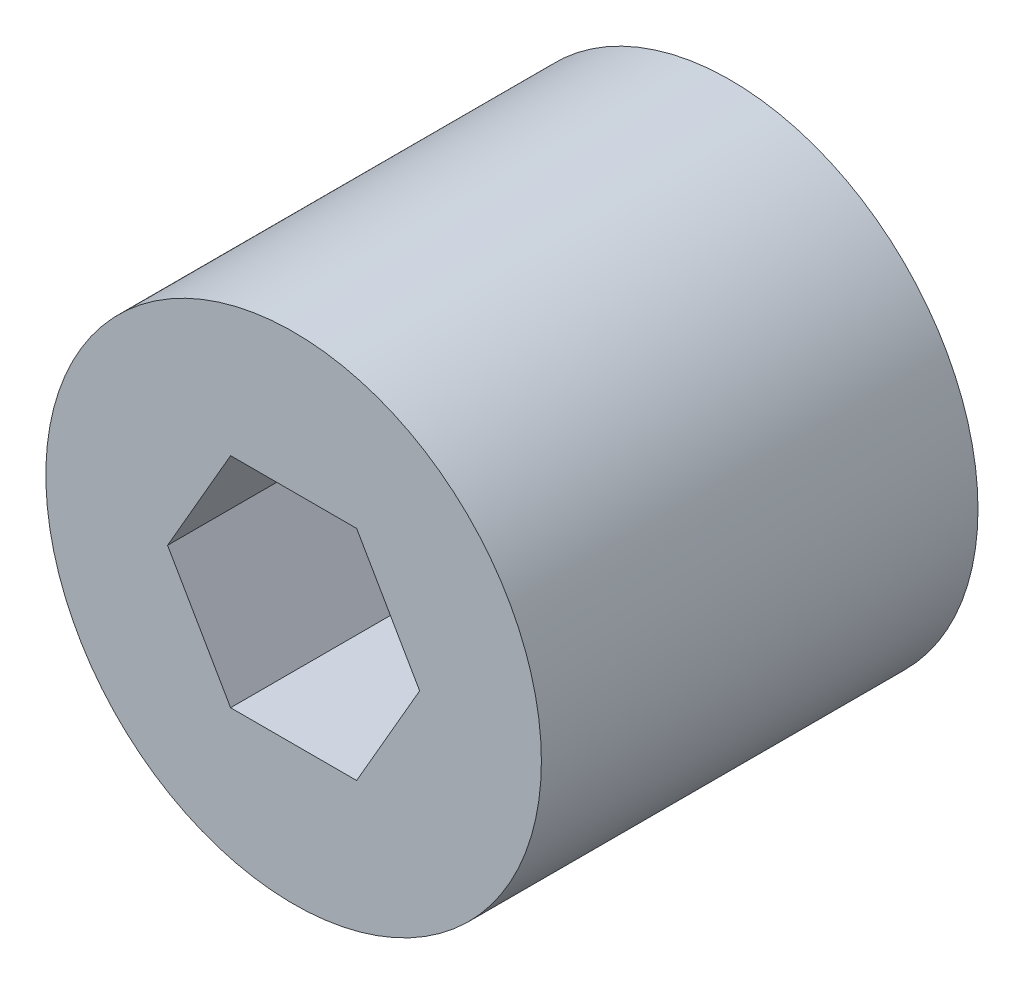
ISO-10303-21;
HEADER;
FILE_DESCRIPTION(('STEP AP214'),'2;1');
FILE_NAME('part.step','',(''),(''),'','','');
FILE_SCHEMA(('AUTOMOTIVE_DESIGN { 1 0 10303 214 1 1 1 1 }'));
ENDSEC;
DATA;
#1=APPLICATION_CONTEXT('core data for automotive mechanical design processes');
#2=APPLICATION_PROTOCOL_DEFINITION('international standard','automotive_design',2000,#1);
#3=PRODUCT_CONTEXT('',#1,'mechanical');
#4=PRODUCT('Part','Part','',(#3));
#5=PRODUCT_RELATED_PRODUCT_CATEGORY('part','',(#4));
#6=PRODUCT_DEFINITION_FORMATION('','',#4);
#7=PRODUCT_DEFINITION_CONTEXT('part definition',#1,'design');
#8=PRODUCT_DEFINITION('design','',#6,#7);
#9=PRODUCT_DEFINITION_SHAPE('','',#8);
#10=(LENGTH_UNIT() NAMED_UNIT(*) SI_UNIT(.MILLI.,.METRE.));
#11=(NAMED_UNIT(*) PLANE_ANGLE_UNIT() SI_UNIT($,.RADIAN.));
#12=(NAMED_UNIT(*) SI_UNIT($,.STERADIAN.) SOLID_ANGLE_UNIT());
#13=UNCERTAINTY_MEASURE_WITH_UNIT(LENGTH_MEASURE(1.E-05),#10,'distance_accuracy_value','');
#14=(GEOMETRIC_REPRESENTATION_CONTEXT(3) GLOBAL_UNCERTAINTY_ASSIGNED_CONTEXT((#13)) GLOBAL_UNIT_ASSIGNED_CONTEXT((#10,
#11,#12)) REPRESENTATION_CONTEXT('',''));
#15=CARTESIAN_POINT('',(0.,0.,0.));
#16=DIRECTION('',(0.,0.,1.));
#17=DIRECTION('',(1.,0.,0.));
#18=AXIS2_PLACEMENT_3D('',#15,#16,#17);
#19=CARTESIAN_POINT('',(0.,0.,-25.4));
#20=DIRECTION('',(0.,0.,1.));
#21=DIRECTION('',(1.,0.,0.));
#22=AXIS2_PLACEMENT_3D('',#19,#20,#21);
#23=CYLINDRICAL_SURFACE('',#22,14.4145);
#24=CARTESIAN_POINT('',(0.,0.,-25.4));
#25=DIRECTION('',(0.,0.,1.));
#26=DIRECTION('',(1.,0.,0.));
#27=AXIS2_PLACEMENT_3D('',#24,#25,#26);
#28=CIRCLE('',#27,14.4145);
#29=CARTESIAN_POINT('',(14.4145,0.,-25.4));
#30=VERTEX_POINT('',#29);
#31=EDGE_CURVE('E11',#30,#30,#28,.T.);
#32=ORIENTED_EDGE('',*,*,#31,.T.);
#33=EDGE_LOOP('',(#32));
#34=FACE_BOUND('',#33,.T.);
#35=CARTESIAN_POINT('',(0.,0.,0.));
#36=DIRECTION('',(0.,0.,1.));
#37=DIRECTION('',(1.,0.,0.));
#38=AXIS2_PLACEMENT_3D('',#35,#36,#37);
#39=CIRCLE('',#38,14.4145);
#40=CARTESIAN_POINT('',(14.4145,0.,0.));
#41=VERTEX_POINT('',#40);
#42=EDGE_CURVE('E39',#41,#41,#39,.T.);
#43=ORIENTED_EDGE('',*,*,#42,.F.);
#44=EDGE_LOOP('',(#43));
#45=FACE_BOUND('',#44,.T.);
#46=ADVANCED_FACE('F36',(#34,#45),#23,.T.);
#47=CARTESIAN_POINT('',(0.,0.,-25.4));
#48=DIRECTION('',(0.,0.,1.));
#49=DIRECTION('',(1.,0.,0.));
#50=AXIS2_PLACEMENT_3D('',#47,#48,#49);
#51=PLANE('',#50);
#52=DIRECTION('',(-0.5,0.866025403784438,0.));
#53=VECTOR('',#52,1.);
#54=CARTESIAN_POINT('',(7.33234841870825,0.,-25.4));
#55=LINE('',#54,#53);
#56=CARTESIAN_POINT('',(7.33234841870825,0.,-25.4));
#57=VERTEX_POINT('',#56);
#58=CARTESIAN_POINT('',(3.66617420935412,6.35,-25.4));
#59=VERTEX_POINT('',#58);
#60=EDGE_CURVE('E96',#57,#59,#55,.T.);
#61=ORIENTED_EDGE('',*,*,#60,.T.);
#62=DIRECTION('',(-1.,0.,0.));
#63=VECTOR('',#62,1.);
#64=CARTESIAN_POINT('',(3.66617420935412,6.35,-25.4));
#65=LINE('',#64,#63);
#66=CARTESIAN_POINT('',(-3.66617420935413,6.35,-25.4));
#67=VERTEX_POINT('',#66);
#68=EDGE_CURVE('E90',#59,#67,#65,.T.);
#69=ORIENTED_EDGE('',*,*,#68,.T.);
#70=DIRECTION('',(-0.5,-0.866025403784439,0.));
#71=VECTOR('',#70,1.);
#72=CARTESIAN_POINT('',(-3.66617420935413,6.35,-25.4));
#73=LINE('',#72,#71);
#74=CARTESIAN_POINT('',(-7.33234841870825,0.,-25.4));
#75=VERTEX_POINT('',#74);
#76=EDGE_CURVE('E99',#67,#75,#73,.T.);
#77=ORIENTED_EDGE('',*,*,#76,.T.);
#78=DIRECTION('',(0.5,-0.866025403784438,0.));
#79=VECTOR('',#78,1.);
#80=CARTESIAN_POINT('',(-7.33234841870825,0.,-25.4));
#81=LINE('',#80,#79);
#82=CARTESIAN_POINT('',(-3.66617420935412,-6.35,-25.4));
#83=VERTEX_POINT('',#82);
#84=EDGE_CURVE('E50',#75,#83,#81,.T.);
#85=ORIENTED_EDGE('',*,*,#84,.T.);
#86=DIRECTION('',(1.,0.,0.));
#87=VECTOR('',#86,1.);
#88=CARTESIAN_POINT('',(-3.66617420935412,-6.35,-25.4));
#89=LINE('',#88,#87);
#90=CARTESIAN_POINT('',(3.66617420935413,-6.35,-25.4));
#91=VERTEX_POINT('',#90);
#92=EDGE_CURVE('E114',#83,#91,#89,.T.);
#93=ORIENTED_EDGE('',*,*,#92,.T.);
#94=DIRECTION('',(0.5,0.866025403784439,0.));
#95=VECTOR('',#94,1.);
#96=CARTESIAN_POINT('',(3.66617420935413,-6.35,-25.4));
#97=LINE('',#96,#95);
#98=EDGE_CURVE('E117',#91,#57,#97,.T.);
#99=ORIENTED_EDGE('',*,*,#98,.T.);
#100=EDGE_LOOP('',(#61,#69,#77,#85,#93,#99));
#101=FACE_BOUND('',#100,.T.);
#102=ORIENTED_EDGE('',*,*,#31,.F.);
#103=EDGE_LOOP('',(#102));
#104=FACE_BOUND('',#103,.T.);
#105=ADVANCED_FACE('F103',(#101,#104),#51,.F.);
#106=CARTESIAN_POINT('',(0.,0.,0.));
#107=DIRECTION('',(0.,0.,1.));
#108=DIRECTION('',(1.,0.,0.));
#109=AXIS2_PLACEMENT_3D('',#106,#107,#108);
#110=PLANE('',#109);
#111=DIRECTION('',(-1.,0.,0.));
#112=VECTOR('',#111,1.);
#113=CARTESIAN_POINT('',(3.66617420935412,6.35,0.));
#114=LINE('',#113,#112);
#115=CARTESIAN_POINT('',(3.66617420935412,6.35,0.));
#116=VERTEX_POINT('',#115);
#117=CARTESIAN_POINT('',(-3.66617420935413,6.35,0.));
#118=VERTEX_POINT('',#117);
#119=EDGE_CURVE('E58',#116,#118,#114,.T.);
#120=ORIENTED_EDGE('',*,*,#119,.F.);
#121=DIRECTION('',(-0.5,0.866025403784438,0.));
#122=VECTOR('',#121,1.);
#123=CARTESIAN_POINT('',(7.33234841870825,0.,0.));
#124=LINE('',#123,#122);
#125=CARTESIAN_POINT('',(7.33234841870825,0.,0.));
#126=VERTEX_POINT('',#125);
#127=EDGE_CURVE('E107',#126,#116,#124,.T.);
#128=ORIENTED_EDGE('',*,*,#127,.F.);
#129=DIRECTION('',(0.5,0.866025403784439,0.));
#130=VECTOR('',#129,1.);
#131=CARTESIAN_POINT('',(3.66617420935413,-6.35,0.));
#132=LINE('',#131,#130);
#133=CARTESIAN_POINT('',(3.66617420935413,-6.35,0.));
#134=VERTEX_POINT('',#133);
#135=EDGE_CURVE('E110',#134,#126,#132,.T.);
#136=ORIENTED_EDGE('',*,*,#135,.F.);
#137=DIRECTION('',(1.,0.,0.));
#138=VECTOR('',#137,1.);
#139=CARTESIAN_POINT('',(-3.66617420935412,-6.35,0.));
#140=LINE('',#139,#138);
#141=CARTESIAN_POINT('',(-3.66617420935412,-6.35,0.));
#142=VERTEX_POINT('',#141);
#143=EDGE_CURVE('E126',#142,#134,#140,.T.);
#144=ORIENTED_EDGE('',*,*,#143,.F.);
#145=DIRECTION('',(0.5,-0.866025403784438,0.));
#146=VECTOR('',#145,1.);
#147=CARTESIAN_POINT('',(-7.33234841870825,0.,0.));
#148=LINE('',#147,#146);
#149=CARTESIAN_POINT('',(-7.33234841870825,0.,0.));
#150=VERTEX_POINT('',#149);
#151=EDGE_CURVE('E123',#150,#142,#148,.T.);
#152=ORIENTED_EDGE('',*,*,#151,.F.);
#153=DIRECTION('',(-0.5,-0.866025403784439,0.));
#154=VECTOR('',#153,1.);
#155=CARTESIAN_POINT('',(-3.66617420935413,6.35,0.));
#156=LINE('',#155,#154);
#157=EDGE_CURVE('E121',#118,#150,#156,.T.);
#158=ORIENTED_EDGE('',*,*,#157,.F.);
#159=EDGE_LOOP('',(#120,#128,#136,#144,#152,#158));
#160=FACE_BOUND('',#159,.T.);
#161=ORIENTED_EDGE('',*,*,#42,.T.);
#162=EDGE_LOOP('',(#161));
#163=FACE_BOUND('',#162,.T.);
#164=ADVANCED_FACE('F143',(#160,#163),#110,.T.);
#165=CARTESIAN_POINT('',(3.66617420935412,6.35,-25.4));
#166=DIRECTION('',(0.,1.,0.));
#167=DIRECTION('',(-1.,0.,0.));
#168=AXIS2_PLACEMENT_3D('',#165,#166,#167);
#169=PLANE('',#168);
#170=ORIENTED_EDGE('',*,*,#119,.T.);
#171=DIRECTION('',(0.,0.,1.));
#172=VECTOR('',#171,1.);
#173=CARTESIAN_POINT('',(-3.66617420935413,6.35,-25.4));
#174=LINE('',#173,#172);
#175=EDGE_CURVE('E86',#67,#118,#174,.T.);
#176=ORIENTED_EDGE('',*,*,#175,.F.);
#177=ORIENTED_EDGE('',*,*,#68,.F.);
#178=DIRECTION('',(0.,0.,1.));
#179=VECTOR('',#178,1.);
#180=CARTESIAN_POINT('',(3.66617420935412,6.35,-25.4));
#181=LINE('',#180,#179);
#182=EDGE_CURVE('E131',#59,#116,#181,.T.);
#183=ORIENTED_EDGE('',*,*,#182,.T.);
#184=EDGE_LOOP('',(#170,#176,#177,#183));
#185=FACE_BOUND('',#184,.T.);
#186=ADVANCED_FACE('F88',(#185),#169,.F.);
#187=CARTESIAN_POINT('',(7.33234841870825,0.,-25.4));
#188=DIRECTION('',(0.866025403784438,0.5,0.));
#189=DIRECTION('',(-0.5,0.866025403784439,0.));
#190=AXIS2_PLACEMENT_3D('',#187,#188,#189);
#191=PLANE('',#190);
#192=ORIENTED_EDGE('',*,*,#127,.T.);
#193=ORIENTED_EDGE('',*,*,#182,.F.);
#194=ORIENTED_EDGE('',*,*,#60,.F.);
#195=DIRECTION('',(0.,0.,1.));
#196=VECTOR('',#195,1.);
#197=CARTESIAN_POINT('',(7.33234841870825,0.,-25.4));
#198=LINE('',#197,#196);
#199=EDGE_CURVE('E133',#57,#126,#198,.T.);
#200=ORIENTED_EDGE('',*,*,#199,.T.);
#201=EDGE_LOOP('',(#192,#193,#194,#200));
#202=FACE_BOUND('',#201,.T.);
#203=ADVANCED_FACE('F154',(#202),#191,.F.);
#204=CARTESIAN_POINT('',(3.66617420935413,-6.35,-25.4));
#205=DIRECTION('',(0.866025403784439,-0.5,0.));
#206=DIRECTION('',(0.5,0.866025403784439,0.));
#207=AXIS2_PLACEMENT_3D('',#204,#205,#206);
#208=PLANE('',#207);
#209=ORIENTED_EDGE('',*,*,#135,.T.);
#210=ORIENTED_EDGE('',*,*,#199,.F.);
#211=ORIENTED_EDGE('',*,*,#98,.F.);
#212=DIRECTION('',(0.,0.,1.));
#213=VECTOR('',#212,1.);
#214=CARTESIAN_POINT('',(3.66617420935413,-6.35,-25.4));
#215=LINE('',#214,#213);
#216=EDGE_CURVE('E135',#91,#134,#215,.T.);
#217=ORIENTED_EDGE('',*,*,#216,.T.);
#218=EDGE_LOOP('',(#209,#210,#211,#217));
#219=FACE_BOUND('',#218,.T.);
#220=ADVANCED_FACE('F152',(#219),#208,.F.);
#221=CARTESIAN_POINT('',(-3.66617420935412,-6.35,-25.4));
#222=DIRECTION('',(0.,-1.,0.));
#223=DIRECTION('',(1.,0.,0.));
#224=AXIS2_PLACEMENT_3D('',#221,#222,#223);
#225=PLANE('',#224);
#226=ORIENTED_EDGE('',*,*,#143,.T.);
#227=ORIENTED_EDGE('',*,*,#216,.F.);
#228=ORIENTED_EDGE('',*,*,#92,.F.);
#229=DIRECTION('',(0.,0.,1.));
#230=VECTOR('',#229,1.);
#231=CARTESIAN_POINT('',(-3.66617420935412,-6.35,-25.4));
#232=LINE('',#231,#230);
#233=EDGE_CURVE('E137',#83,#142,#232,.T.);
#234=ORIENTED_EDGE('',*,*,#233,.T.);
#235=EDGE_LOOP('',(#226,#227,#228,#234));
#236=FACE_BOUND('',#235,.T.);
#237=ADVANCED_FACE('F148',(#236),#225,.F.);
#238=CARTESIAN_POINT('',(-7.33234841870825,0.,-25.4));
#239=DIRECTION('',(-0.866025403784438,-0.5,0.));
#240=DIRECTION('',(0.5,-0.866025403784438,0.));
#241=AXIS2_PLACEMENT_3D('',#238,#239,#240);
#242=PLANE('',#241);
#243=ORIENTED_EDGE('',*,*,#151,.T.);
#244=ORIENTED_EDGE('',*,*,#233,.F.);
#245=ORIENTED_EDGE('',*,*,#84,.F.);
#246=DIRECTION('',(0.,0.,1.));
#247=VECTOR('',#246,1.);
#248=CARTESIAN_POINT('',(-7.33234841870825,0.,-25.4));
#249=LINE('',#248,#247);
#250=EDGE_CURVE('E95',#75,#150,#249,.T.);
#251=ORIENTED_EDGE('',*,*,#250,.T.);
#252=EDGE_LOOP('',(#243,#244,#245,#251));
#253=FACE_BOUND('',#252,.T.);
#254=ADVANCED_FACE('F139',(#253),#242,.F.);
#255=CARTESIAN_POINT('',(-3.66617420935413,6.35,-25.4));
#256=DIRECTION('',(-0.866025403784439,0.5,0.));
#257=DIRECTION('',(-0.5,-0.866025403784439,0.));
#258=AXIS2_PLACEMENT_3D('',#255,#256,#257);
#259=PLANE('',#258);
#260=ORIENTED_EDGE('',*,*,#157,.T.);
#261=ORIENTED_EDGE('',*,*,#250,.F.);
#262=ORIENTED_EDGE('',*,*,#76,.F.);
#263=ORIENTED_EDGE('',*,*,#175,.T.);
#264=EDGE_LOOP('',(#260,#261,#262,#263));
#265=FACE_BOUND('',#264,.T.);
#266=ADVANCED_FACE('F100',(#265),#259,.F.);
#267=CLOSED_SHELL('',(#46,#105,#164,#186,#203,#220,#237,#254,#266));
#268=MANIFOLD_SOLID_BREP('B2',#267);
#269=ADVANCED_BREP_SHAPE_REPRESENTATION('',(#18,#268),#14);
#270=SHAPE_DEFINITION_REPRESENTATION(#9,#269);
ENDSEC;
END-ISO-10303-21;
